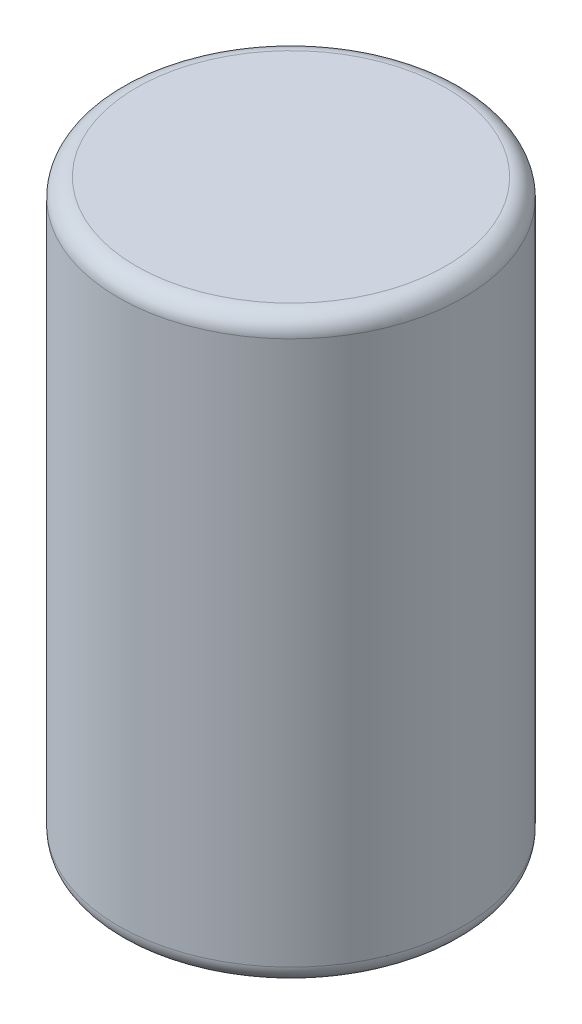
ISO-10303-21;
HEADER;
FILE_DESCRIPTION(('STEP AP214'),'2;1');
FILE_NAME('part.step','',(''),(''),'','','');
FILE_SCHEMA(('AUTOMOTIVE_DESIGN { 1 0 10303 214 1 1 1 1 }'));
ENDSEC;
DATA;
#1=APPLICATION_CONTEXT('core data for automotive mechanical design processes');
#2=APPLICATION_PROTOCOL_DEFINITION('international standard','automotive_design',2000,#1);
#3=PRODUCT_CONTEXT('',#1,'mechanical');
#4=PRODUCT('Part','Part','',(#3));
#5=PRODUCT_RELATED_PRODUCT_CATEGORY('part','',(#4));
#6=PRODUCT_DEFINITION_FORMATION('','',#4);
#7=PRODUCT_DEFINITION_CONTEXT('part definition',#1,'design');
#8=PRODUCT_DEFINITION('design','',#6,#7);
#9=PRODUCT_DEFINITION_SHAPE('','',#8);
#10=(LENGTH_UNIT() NAMED_UNIT(*) SI_UNIT(.MILLI.,.METRE.));
#11=(NAMED_UNIT(*) PLANE_ANGLE_UNIT() SI_UNIT($,.RADIAN.));
#12=(NAMED_UNIT(*) SI_UNIT($,.STERADIAN.) SOLID_ANGLE_UNIT());
#13=UNCERTAINTY_MEASURE_WITH_UNIT(LENGTH_MEASURE(1.E-05),#10,'distance_accuracy_value','');
#14=(GEOMETRIC_REPRESENTATION_CONTEXT(3) GLOBAL_UNCERTAINTY_ASSIGNED_CONTEXT((#13)) GLOBAL_UNIT_ASSIGNED_CONTEXT((#10,
#11,#12)) REPRESENTATION_CONTEXT('',''));
#15=CARTESIAN_POINT('',(0.,0.,0.));
#16=DIRECTION('',(0.,0.,1.));
#17=DIRECTION('',(1.,0.,0.));
#18=AXIS2_PLACEMENT_3D('',#15,#16,#17);
#19=CARTESIAN_POINT('',(0.,16.,0.));
#20=DIRECTION('',(0.,-1.,0.));
#21=DIRECTION('',(0.,0.,-1.));
#22=AXIS2_PLACEMENT_3D('',#19,#20,#21);
#23=CYLINDRICAL_SURFACE('',#22,4.7625);
#24=CARTESIAN_POINT('',(0.,0.5,0.));
#25=DIRECTION('',(0.,1.,0.));
#26=DIRECTION('',(0.,0.,1.));
#27=AXIS2_PLACEMENT_3D('',#24,#25,#26);
#28=CIRCLE('',#27,4.7625);
#29=CARTESIAN_POINT('',(0.,0.5,4.7625));
#30=VERTEX_POINT('',#29);
#31=EDGE_CURVE('E51',#30,#30,#28,.T.);
#32=ORIENTED_EDGE('',*,*,#31,.T.);
#33=EDGE_LOOP('',(#32));
#34=FACE_BOUND('',#33,.T.);
#35=CARTESIAN_POINT('',(0.,15.5,0.));
#36=DIRECTION('',(0.,1.,0.));
#37=DIRECTION('',(0.,0.,1.));
#38=AXIS2_PLACEMENT_3D('',#35,#36,#37);
#39=CIRCLE('',#38,4.7625);
#40=CARTESIAN_POINT('',(0.,15.5,4.7625));
#41=VERTEX_POINT('',#40);
#42=EDGE_CURVE('E57',#41,#41,#39,.F.);
#43=ORIENTED_EDGE('',*,*,#42,.T.);
#44=EDGE_LOOP('',(#43));
#45=FACE_BOUND('',#44,.T.);
#46=ADVANCED_FACE('F43',(#34,#45),#23,.T.);
#47=CARTESIAN_POINT('',(0.,16.,0.));
#48=DIRECTION('',(0.,1.,0.));
#49=DIRECTION('',(0.,0.,1.));
#50=AXIS2_PLACEMENT_3D('',#47,#48,#49);
#51=PLANE('',#50);
#52=CARTESIAN_POINT('',(0.,16.,0.));
#53=DIRECTION('',(0.,1.,0.));
#54=DIRECTION('',(0.,0.,1.));
#55=AXIS2_PLACEMENT_3D('',#52,#53,#54);
#56=CIRCLE('',#55,4.2625);
#57=CARTESIAN_POINT('',(0.,16.,4.2625));
#58=VERTEX_POINT('',#57);
#59=EDGE_CURVE('E64',#58,#58,#56,.T.);
#60=ORIENTED_EDGE('',*,*,#59,.T.);
#61=EDGE_LOOP('',(#60));
#62=FACE_BOUND('',#61,.T.);
#63=ADVANCED_FACE('F69',(#62),#51,.T.);
#64=CARTESIAN_POINT('',(0.,0.,0.));
#65=DIRECTION('',(0.,1.,0.));
#66=DIRECTION('',(0.,0.,1.));
#67=AXIS2_PLACEMENT_3D('',#64,#65,#66);
#68=PLANE('',#67);
#69=CARTESIAN_POINT('',(0.,0.,0.));
#70=DIRECTION('',(0.,1.,0.));
#71=DIRECTION('',(0.,0.,1.));
#72=AXIS2_PLACEMENT_3D('',#69,#70,#71);
#73=CIRCLE('',#72,4.2625);
#74=CARTESIAN_POINT('',(0.,0.,4.2625));
#75=VERTEX_POINT('',#74);
#76=EDGE_CURVE('E10',#75,#75,#73,.F.);
#77=ORIENTED_EDGE('',*,*,#76,.T.);
#78=EDGE_LOOP('',(#77));
#79=FACE_BOUND('',#78,.T.);
#80=ADVANCED_FACE('F75',(#79),#68,.F.);
#81=CARTESIAN_POINT('',(0.,15.5,0.));
#82=DIRECTION('',(0.,1.,0.));
#83=DIRECTION('',(0.,0.,1.));
#84=AXIS2_PLACEMENT_3D('',#81,#82,#83);
#85=TOROIDAL_SURFACE('',#84,4.2625,0.5);
#86=ORIENTED_EDGE('',*,*,#42,.F.);
#87=EDGE_LOOP('',(#86));
#88=FACE_BOUND('',#87,.T.);
#89=ORIENTED_EDGE('',*,*,#59,.F.);
#90=EDGE_LOOP('',(#89));
#91=FACE_BOUND('',#90,.T.);
#92=ADVANCED_FACE('F68',(#88,#91),#85,.T.);
#93=CARTESIAN_POINT('',(0.,0.5,0.));
#94=DIRECTION('',(0.,1.,0.));
#95=DIRECTION('',(0.,0.,1.));
#96=AXIS2_PLACEMENT_3D('',#93,#94,#95);
#97=TOROIDAL_SURFACE('',#96,4.2625,0.5);
#98=ORIENTED_EDGE('',*,*,#76,.F.);
#99=EDGE_LOOP('',(#98));
#100=FACE_BOUND('',#99,.T.);
#101=ORIENTED_EDGE('',*,*,#31,.F.);
#102=EDGE_LOOP('',(#101));
#103=FACE_BOUND('',#102,.T.);
#104=ADVANCED_FACE('F44',(#100,#103),#97,.T.);
#105=CLOSED_SHELL('',(#46,#63,#80,#92,#104));
#106=MANIFOLD_SOLID_BREP('B2',#105);
#107=ADVANCED_BREP_SHAPE_REPRESENTATION('',(#18,#106),#14);
#108=SHAPE_DEFINITION_REPRESENTATION(#9,#107);
ENDSEC;
END-ISO-10303-21;
